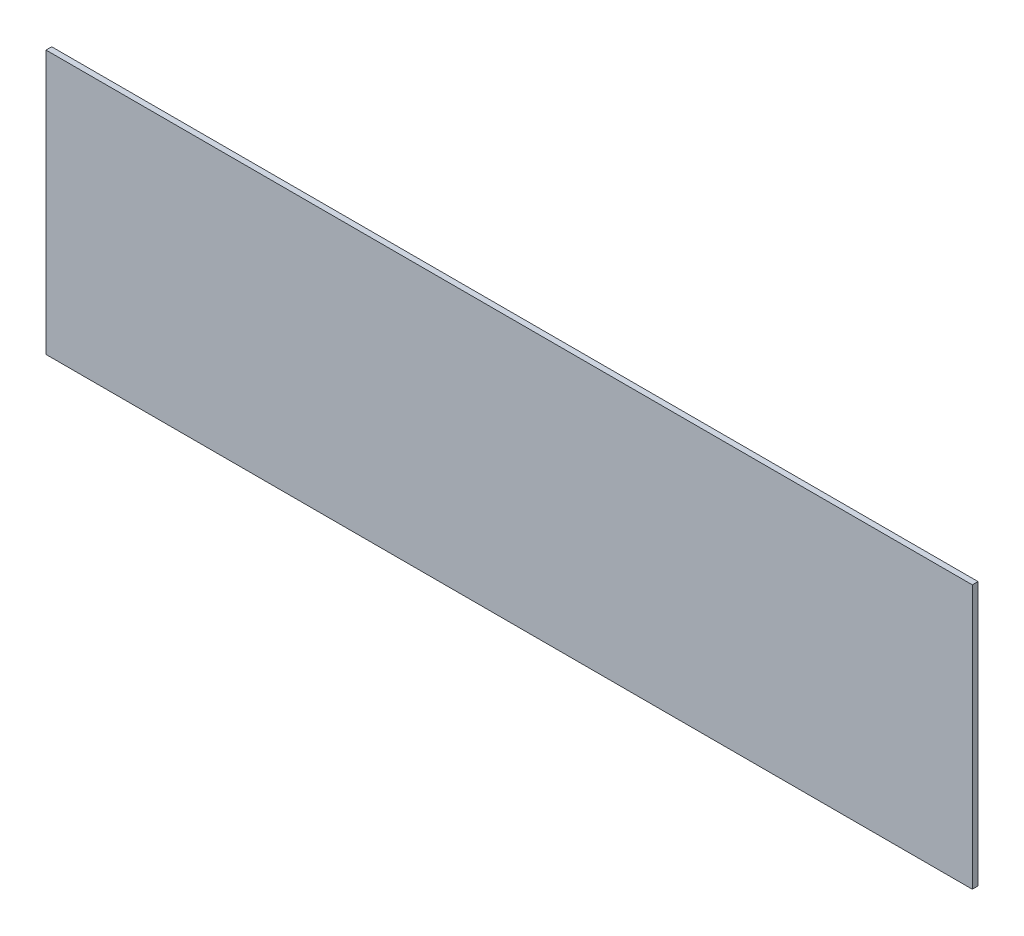
ISO-10303-21;
HEADER;
FILE_DESCRIPTION(('STEP AP214'),'2;1');
FILE_NAME('part.step','',(''),(''),'','','');
FILE_SCHEMA(('AUTOMOTIVE_DESIGN { 1 0 10303 214 1 1 1 1 }'));
ENDSEC;
DATA;
#1=APPLICATION_CONTEXT('core data for automotive mechanical design processes');
#2=APPLICATION_PROTOCOL_DEFINITION('international standard','automotive_design',2000,#1);
#3=PRODUCT_CONTEXT('',#1,'mechanical');
#4=PRODUCT('Part','Part','',(#3));
#5=PRODUCT_RELATED_PRODUCT_CATEGORY('part','',(#4));
#6=PRODUCT_DEFINITION_FORMATION('','',#4);
#7=PRODUCT_DEFINITION_CONTEXT('part definition',#1,'design');
#8=PRODUCT_DEFINITION('design','',#6,#7);
#9=PRODUCT_DEFINITION_SHAPE('','',#8);
#10=(LENGTH_UNIT() NAMED_UNIT(*) SI_UNIT(.MILLI.,.METRE.));
#11=(NAMED_UNIT(*) PLANE_ANGLE_UNIT() SI_UNIT($,.RADIAN.));
#12=(NAMED_UNIT(*) SI_UNIT($,.STERADIAN.) SOLID_ANGLE_UNIT());
#13=UNCERTAINTY_MEASURE_WITH_UNIT(LENGTH_MEASURE(1.E-05),#10,'distance_accuracy_value','');
#14=(GEOMETRIC_REPRESENTATION_CONTEXT(3) GLOBAL_UNCERTAINTY_ASSIGNED_CONTEXT((#13)) GLOBAL_UNIT_ASSIGNED_CONTEXT((#10,
#11,#12)) REPRESENTATION_CONTEXT('',''));
#15=CARTESIAN_POINT('',(0.,0.,0.));
#16=DIRECTION('',(0.,0.,1.));
#17=DIRECTION('',(1.,0.,0.));
#18=AXIS2_PLACEMENT_3D('',#15,#16,#17);
#19=CARTESIAN_POINT('',(162.5,-46.25,2.));
#20=DIRECTION('',(-1.,0.,0.));
#21=DIRECTION('',(0.,0.,1.));
#22=AXIS2_PLACEMENT_3D('',#19,#20,#21);
#23=PLANE('',#22);
#24=DIRECTION('',(0.,1.,0.));
#25=VECTOR('',#24,1.);
#26=CARTESIAN_POINT('',(162.5,-46.25,0.));
#27=LINE('',#26,#25);
#28=CARTESIAN_POINT('',(162.5,-46.25,0.));
#29=VERTEX_POINT('',#28);
#30=CARTESIAN_POINT('',(162.5,46.25,0.));
#31=VERTEX_POINT('',#30);
#32=EDGE_CURVE('E109',#29,#31,#27,.T.);
#33=ORIENTED_EDGE('',*,*,#32,.T.);
#34=DIRECTION('',(0.,0.,-1.));
#35=VECTOR('',#34,1.);
#36=CARTESIAN_POINT('',(162.5,46.25,2.));
#37=LINE('',#36,#35);
#38=CARTESIAN_POINT('',(162.5,46.25,2.));
#39=VERTEX_POINT('',#38);
#40=EDGE_CURVE('E11',#39,#31,#37,.T.);
#41=ORIENTED_EDGE('',*,*,#40,.F.);
#42=DIRECTION('',(0.,1.,0.));
#43=VECTOR('',#42,1.);
#44=CARTESIAN_POINT('',(162.5,-46.25,2.));
#45=LINE('',#44,#43);
#46=CARTESIAN_POINT('',(162.5,-46.25,2.));
#47=VERTEX_POINT('',#46);
#48=EDGE_CURVE('E93',#47,#39,#45,.T.);
#49=ORIENTED_EDGE('',*,*,#48,.F.);
#50=DIRECTION('',(0.,0.,-1.));
#51=VECTOR('',#50,1.);
#52=CARTESIAN_POINT('',(162.5,-46.25,2.));
#53=LINE('',#52,#51);
#54=EDGE_CURVE('E105',#47,#29,#53,.T.);
#55=ORIENTED_EDGE('',*,*,#54,.T.);
#56=EDGE_LOOP('',(#33,#41,#49,#55));
#57=FACE_BOUND('',#56,.T.);
#58=ADVANCED_FACE('F41',(#57),#23,.F.);
#59=CARTESIAN_POINT('',(-162.5,46.25,2.));
#60=DIRECTION('',(0.,-1.,0.));
#61=DIRECTION('',(0.,0.,-1.));
#62=AXIS2_PLACEMENT_3D('',#59,#60,#61);
#63=PLANE('',#62);
#64=DIRECTION('',(-1.,0.,0.));
#65=VECTOR('',#64,1.);
#66=CARTESIAN_POINT('',(-162.5,46.25,0.));
#67=LINE('',#66,#65);
#68=CARTESIAN_POINT('',(-162.5,46.25,0.));
#69=VERTEX_POINT('',#68);
#70=EDGE_CURVE('E98',#31,#69,#67,.T.);
#71=ORIENTED_EDGE('',*,*,#70,.T.);
#72=DIRECTION('',(0.,0.,-1.));
#73=VECTOR('',#72,1.);
#74=CARTESIAN_POINT('',(-162.5,46.25,2.));
#75=LINE('',#74,#73);
#76=CARTESIAN_POINT('',(-162.5,46.25,2.));
#77=VERTEX_POINT('',#76);
#78=EDGE_CURVE('E50',#77,#69,#75,.T.);
#79=ORIENTED_EDGE('',*,*,#78,.F.);
#80=DIRECTION('',(-1.,0.,0.));
#81=VECTOR('',#80,1.);
#82=CARTESIAN_POINT('',(-162.5,46.25,2.));
#83=LINE('',#82,#81);
#84=EDGE_CURVE('E88',#39,#77,#83,.T.);
#85=ORIENTED_EDGE('',*,*,#84,.F.);
#86=ORIENTED_EDGE('',*,*,#40,.T.);
#87=EDGE_LOOP('',(#71,#79,#85,#86));
#88=FACE_BOUND('',#87,.T.);
#89=ADVANCED_FACE('F97',(#88),#63,.F.);
#90=CARTESIAN_POINT('',(-162.5,-46.25,2.));
#91=DIRECTION('',(1.,0.,0.));
#92=DIRECTION('',(0.,0.,-1.));
#93=AXIS2_PLACEMENT_3D('',#90,#91,#92);
#94=PLANE('',#93);
#95=DIRECTION('',(0.,-1.,0.));
#96=VECTOR('',#95,1.);
#97=CARTESIAN_POINT('',(-162.5,-46.25,0.));
#98=LINE('',#97,#96);
#99=CARTESIAN_POINT('',(-162.5,-46.25,0.));
#100=VERTEX_POINT('',#99);
#101=EDGE_CURVE('E75',#69,#100,#98,.T.);
#102=ORIENTED_EDGE('',*,*,#101,.T.);
#103=DIRECTION('',(0.,0.,-1.));
#104=VECTOR('',#103,1.);
#105=CARTESIAN_POINT('',(-162.5,-46.25,2.));
#106=LINE('',#105,#104);
#107=CARTESIAN_POINT('',(-162.5,-46.25,2.));
#108=VERTEX_POINT('',#107);
#109=EDGE_CURVE('E100',#108,#100,#106,.T.);
#110=ORIENTED_EDGE('',*,*,#109,.F.);
#111=DIRECTION('',(0.,-1.,0.));
#112=VECTOR('',#111,1.);
#113=CARTESIAN_POINT('',(-162.5,-46.25,2.));
#114=LINE('',#113,#112);
#115=EDGE_CURVE('E91',#77,#108,#114,.T.);
#116=ORIENTED_EDGE('',*,*,#115,.F.);
#117=ORIENTED_EDGE('',*,*,#78,.T.);
#118=EDGE_LOOP('',(#102,#110,#116,#117));
#119=FACE_BOUND('',#118,.T.);
#120=ADVANCED_FACE('F101',(#119),#94,.F.);
#121=CARTESIAN_POINT('',(-162.5,-46.25,2.));
#122=DIRECTION('',(0.,1.,0.));
#123=DIRECTION('',(0.,0.,1.));
#124=AXIS2_PLACEMENT_3D('',#121,#122,#123);
#125=PLANE('',#124);
#126=DIRECTION('',(1.,0.,0.));
#127=VECTOR('',#126,1.);
#128=CARTESIAN_POINT('',(-162.5,-46.25,0.));
#129=LINE('',#128,#127);
#130=EDGE_CURVE('E81',#100,#29,#129,.T.);
#131=ORIENTED_EDGE('',*,*,#130,.T.);
#132=ORIENTED_EDGE('',*,*,#54,.F.);
#133=DIRECTION('',(1.,0.,0.));
#134=VECTOR('',#133,1.);
#135=CARTESIAN_POINT('',(-162.5,-46.25,2.));
#136=LINE('',#135,#134);
#137=EDGE_CURVE('E58',#108,#47,#136,.T.);
#138=ORIENTED_EDGE('',*,*,#137,.F.);
#139=ORIENTED_EDGE('',*,*,#109,.T.);
#140=EDGE_LOOP('',(#131,#132,#138,#139));
#141=FACE_BOUND('',#140,.T.);
#142=ADVANCED_FACE('F122',(#141),#125,.F.);
#143=CARTESIAN_POINT('',(0.,0.,2.));
#144=DIRECTION('',(0.,0.,-1.));
#145=DIRECTION('',(-1.,0.,0.));
#146=AXIS2_PLACEMENT_3D('',#143,#144,#145);
#147=PLANE('',#146);
#148=ORIENTED_EDGE('',*,*,#48,.T.);
#149=ORIENTED_EDGE('',*,*,#84,.T.);
#150=ORIENTED_EDGE('',*,*,#115,.T.);
#151=ORIENTED_EDGE('',*,*,#137,.T.);
#152=EDGE_LOOP('',(#148,#149,#150,#151));
#153=FACE_BOUND('',#152,.T.);
#154=ADVANCED_FACE('F89',(#153),#147,.F.);
#155=CARTESIAN_POINT('',(0.,0.,0.));
#156=DIRECTION('',(0.,0.,-1.));
#157=DIRECTION('',(-1.,0.,0.));
#158=AXIS2_PLACEMENT_3D('',#155,#156,#157);
#159=PLANE('',#158);
#160=ORIENTED_EDGE('',*,*,#32,.F.);
#161=ORIENTED_EDGE('',*,*,#130,.F.);
#162=ORIENTED_EDGE('',*,*,#101,.F.);
#163=ORIENTED_EDGE('',*,*,#70,.F.);
#164=EDGE_LOOP('',(#160,#161,#162,#163));
#165=FACE_BOUND('',#164,.T.);
#166=ADVANCED_FACE('F125',(#165),#159,.T.);
#167=CLOSED_SHELL('',(#58,#89,#120,#142,#154,#166));
#168=MANIFOLD_SOLID_BREP('B2',#167);
#169=ADVANCED_BREP_SHAPE_REPRESENTATION('',(#18,#168),#14);
#170=SHAPE_DEFINITION_REPRESENTATION(#9,#169);
ENDSEC;
END-ISO-10303-21;
